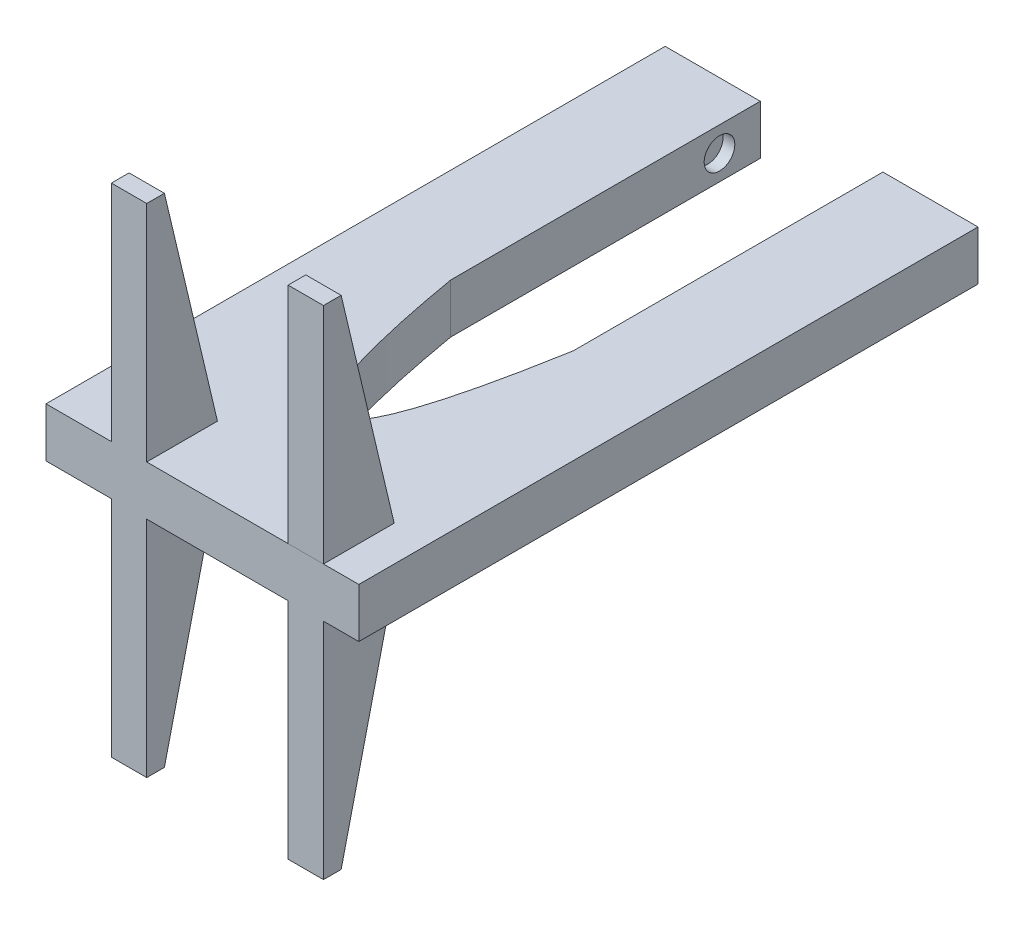
ISO-10303-21;
HEADER;
FILE_DESCRIPTION(('STEP AP214'),'2;1');
FILE_NAME('part.step','',(''),(''),'','','');
FILE_SCHEMA(('AUTOMOTIVE_DESIGN { 1 0 10303 214 1 1 1 1 }'));
ENDSEC;
DATA;
#1=APPLICATION_CONTEXT('core data for automotive mechanical design processes');
#2=APPLICATION_PROTOCOL_DEFINITION('international standard','automotive_design',2000,#1);
#3=PRODUCT_CONTEXT('',#1,'mechanical');
#4=PRODUCT('Part','Part','',(#3));
#5=PRODUCT_RELATED_PRODUCT_CATEGORY('part','',(#4));
#6=PRODUCT_DEFINITION_FORMATION('','',#4);
#7=PRODUCT_DEFINITION_CONTEXT('part definition',#1,'design');
#8=PRODUCT_DEFINITION('design','',#6,#7);
#9=PRODUCT_DEFINITION_SHAPE('','',#8);
#10=(LENGTH_UNIT() NAMED_UNIT(*) SI_UNIT(.MILLI.,.METRE.));
#11=(NAMED_UNIT(*) PLANE_ANGLE_UNIT() SI_UNIT($,.RADIAN.));
#12=(NAMED_UNIT(*) SI_UNIT($,.STERADIAN.) SOLID_ANGLE_UNIT());
#13=UNCERTAINTY_MEASURE_WITH_UNIT(LENGTH_MEASURE(1.E-05),#10,'distance_accuracy_value','');
#14=(GEOMETRIC_REPRESENTATION_CONTEXT(3) GLOBAL_UNCERTAINTY_ASSIGNED_CONTEXT((#13)) GLOBAL_UNIT_ASSIGNED_CONTEXT((#10,
#11,#12)) REPRESENTATION_CONTEXT('',''));
#15=CARTESIAN_POINT('',(0.,0.,0.));
#16=DIRECTION('',(0.,0.,1.));
#17=DIRECTION('',(1.,0.,0.));
#18=AXIS2_PLACEMENT_3D('',#15,#16,#17);
#19=CARTESIAN_POINT('',(-300.,420.,4655.));
#20=DIRECTION('',(0.,-1.,0.));
#21=DIRECTION('',(0.,0.,-1.));
#22=AXIS2_PLACEMENT_3D('',#19,#20,#21);
#23=PLANE('',#22);
#24=DIRECTION('',(0.,0.,-1.));
#25=VECTOR('',#24,1.);
#26=CARTESIAN_POINT('',(0.,420.,4655.));
#27=LINE('',#26,#25);
#28=CARTESIAN_POINT('',(0.,420.,5255.));
#29=VERTEX_POINT('',#28);
#30=CARTESIAN_POINT('',(0.,420.,4655.));
#31=VERTEX_POINT('',#30);
#32=EDGE_CURVE('E109',#29,#31,#27,.T.);
#33=ORIENTED_EDGE('',*,*,#32,.F.);
#34=DIRECTION('',(1.,0.,0.));
#35=VECTOR('',#34,1.);
#36=CARTESIAN_POINT('',(-300.,420.,5255.));
#37=LINE('',#36,#35);
#38=CARTESIAN_POINT('',(-300.,420.,5255.));
#39=VERTEX_POINT('',#38);
#40=EDGE_CURVE('E12',#39,#29,#37,.T.);
#41=ORIENTED_EDGE('',*,*,#40,.F.);
#42=DIRECTION('',(0.,0.,-1.));
#43=VECTOR('',#42,1.);
#44=CARTESIAN_POINT('',(-300.,420.,4655.));
#45=LINE('',#44,#43);
#46=CARTESIAN_POINT('',(-300.,420.,4655.));
#47=VERTEX_POINT('',#46);
#48=EDGE_CURVE('E103',#39,#47,#45,.T.);
#49=ORIENTED_EDGE('',*,*,#48,.T.);
#50=DIRECTION('',(1.,0.,0.));
#51=VECTOR('',#50,1.);
#52=CARTESIAN_POINT('',(-300.,420.,4655.));
#53=LINE('',#52,#51);
#54=EDGE_CURVE('E48',#47,#31,#53,.T.);
#55=ORIENTED_EDGE('',*,*,#54,.T.);
#56=EDGE_LOOP('',(#33,#41,#49,#55));
#57=FACE_BOUND('',#56,.T.);
#58=ADVANCED_FACE('F45',(#57),#23,.T.);
#59=CARTESIAN_POINT('',(-300.,420.,5255.));
#60=DIRECTION('',(0.,0.,1.));
#61=DIRECTION('',(1.,0.,0.));
#62=AXIS2_PLACEMENT_3D('',#59,#60,#61);
#63=PLANE('',#62);
#64=DIRECTION('',(0.,-1.,0.));
#65=VECTOR('',#64,1.);
#66=CARTESIAN_POINT('',(0.,420.,5255.));
#67=LINE('',#66,#65);
#68=CARTESIAN_POINT('',(0.,2320.,5255.));
#69=VERTEX_POINT('',#68);
#70=EDGE_CURVE('E105',#69,#29,#67,.T.);
#71=ORIENTED_EDGE('',*,*,#70,.F.);
#72=DIRECTION('',(1.,0.,0.));
#73=VECTOR('',#72,1.);
#74=CARTESIAN_POINT('',(-300.,2320.,5255.));
#75=LINE('',#74,#73);
#76=CARTESIAN_POINT('',(-300.,2320.,5255.));
#77=VERTEX_POINT('',#76);
#78=EDGE_CURVE('E54',#77,#69,#75,.T.);
#79=ORIENTED_EDGE('',*,*,#78,.F.);
#80=DIRECTION('',(0.,-1.,0.));
#81=VECTOR('',#80,1.);
#82=CARTESIAN_POINT('',(-300.,420.,5255.));
#83=LINE('',#82,#81);
#84=EDGE_CURVE('E100',#77,#39,#83,.T.);
#85=ORIENTED_EDGE('',*,*,#84,.T.);
#86=ORIENTED_EDGE('',*,*,#40,.T.);
#87=EDGE_LOOP('',(#71,#79,#85,#86));
#88=FACE_BOUND('',#87,.T.);
#89=ADVANCED_FACE('F119',(#88),#63,.T.);
#90=CARTESIAN_POINT('',(-300.,2320.,5255.));
#91=DIRECTION('',(0.,1.,0.));
#92=DIRECTION('',(0.,0.,1.));
#93=AXIS2_PLACEMENT_3D('',#90,#91,#92);
#94=PLANE('',#93);
#95=DIRECTION('',(0.,0.,1.));
#96=VECTOR('',#95,1.);
#97=CARTESIAN_POINT('',(0.,2320.,5255.));
#98=LINE('',#97,#96);
#99=CARTESIAN_POINT('',(0.,2320.,5105.));
#100=VERTEX_POINT('',#99);
#101=EDGE_CURVE('E95',#100,#69,#98,.T.);
#102=ORIENTED_EDGE('',*,*,#101,.F.);
#103=DIRECTION('',(1.,0.,0.));
#104=VECTOR('',#103,1.);
#105=CARTESIAN_POINT('',(-300.,2320.,5105.));
#106=LINE('',#105,#104);
#107=CARTESIAN_POINT('',(-300.,2320.,5105.));
#108=VERTEX_POINT('',#107);
#109=EDGE_CURVE('E90',#108,#100,#106,.T.);
#110=ORIENTED_EDGE('',*,*,#109,.F.);
#111=DIRECTION('',(0.,0.,1.));
#112=VECTOR('',#111,1.);
#113=CARTESIAN_POINT('',(-300.,2320.,5255.));
#114=LINE('',#113,#112);
#115=EDGE_CURVE('E93',#108,#77,#114,.T.);
#116=ORIENTED_EDGE('',*,*,#115,.T.);
#117=ORIENTED_EDGE('',*,*,#78,.T.);
#118=EDGE_LOOP('',(#102,#110,#116,#117));
#119=FACE_BOUND('',#118,.T.);
#120=ADVANCED_FACE('F92',(#119),#94,.T.);
#121=CARTESIAN_POINT('',(-300.,2320.,5105.));
#122=DIRECTION('',(0.,0.230466383879212,-0.97308028749001));
#123=DIRECTION('',(0.,0.97308028749001,0.230466383879212));
#124=AXIS2_PLACEMENT_3D('',#121,#122,#123);
#125=PLANE('',#124);
#126=DIRECTION('',(0.,0.97308028749001,0.230466383879212));
#127=VECTOR('',#126,1.);
#128=CARTESIAN_POINT('',(0.,2320.,5105.));
#129=LINE('',#128,#127);
#130=EDGE_CURVE('E112',#31,#100,#129,.T.);
#131=ORIENTED_EDGE('',*,*,#130,.F.);
#132=ORIENTED_EDGE('',*,*,#54,.F.);
#133=DIRECTION('',(0.,0.97308028749001,0.230466383879212));
#134=VECTOR('',#133,1.);
#135=CARTESIAN_POINT('',(-300.,2320.,5105.));
#136=LINE('',#135,#134);
#137=EDGE_CURVE('E99',#47,#108,#136,.T.);
#138=ORIENTED_EDGE('',*,*,#137,.T.);
#139=ORIENTED_EDGE('',*,*,#109,.T.);
#140=EDGE_LOOP('',(#131,#132,#138,#139));
#141=FACE_BOUND('',#140,.T.);
#142=ADVANCED_FACE('F102',(#141),#125,.T.);
#143=CARTESIAN_POINT('',(-300.,0.,0.));
#144=DIRECTION('',(-1.,0.,0.));
#145=DIRECTION('',(0.,0.,1.));
#146=AXIS2_PLACEMENT_3D('',#143,#144,#145);
#147=PLANE('',#146);
#148=ORIENTED_EDGE('',*,*,#48,.F.);
#149=ORIENTED_EDGE('',*,*,#84,.F.);
#150=ORIENTED_EDGE('',*,*,#115,.F.);
#151=ORIENTED_EDGE('',*,*,#137,.F.);
#152=EDGE_LOOP('',(#148,#149,#150,#151));
#153=FACE_BOUND('',#152,.T.);
#154=ADVANCED_FACE('F98',(#153),#147,.T.);
#155=CARTESIAN_POINT('',(0.,0.,0.));
#156=DIRECTION('',(-1.,0.,0.));
#157=DIRECTION('',(0.,0.,1.));
#158=AXIS2_PLACEMENT_3D('',#155,#156,#157);
#159=PLANE('',#158);
#160=ORIENTED_EDGE('',*,*,#32,.T.);
#161=ORIENTED_EDGE('',*,*,#130,.T.);
#162=ORIENTED_EDGE('',*,*,#101,.T.);
#163=ORIENTED_EDGE('',*,*,#70,.T.);
#164=EDGE_LOOP('',(#160,#161,#162,#163));
#165=FACE_BOUND('',#164,.T.);
#166=ADVANCED_FACE('F118',(#165),#159,.F.);
#167=CLOSED_SHELL('',(#58,#89,#120,#142,#154,#166));
#168=MANIFOLD_SOLID_BREP('B2',#167);
#169=CARTESIAN_POINT('',(-1027.5,0.,4120.1934343167));
#170=DIRECTION('',(0.,-1.,0.));
#171=DIRECTION('',(0.,0.,-1.));
#172=AXIS2_PLACEMENT_3D('',#169,#170,#171);
#173=PLANE('',#172);
#174=DIRECTION('',(1.,0.,0.));
#175=VECTOR('',#174,1.);
#176=CARTESIAN_POINT('',(300.000000000001,0.,5255.));
#177=LINE('',#176,#175);
#178=CARTESIAN_POINT('',(-1500.,0.,5255.));
#179=VERTEX_POINT('',#178);
#180=CARTESIAN_POINT('',(-300.,0.,5255.));
#181=VERTEX_POINT('',#180);
#182=EDGE_CURVE('E506',#179,#181,#177,.T.);
#183=ORIENTED_EDGE('',*,*,#182,.F.);
#184=DIRECTION('',(0.,0.,-1.));
#185=VECTOR('',#184,1.);
#186=CARTESIAN_POINT('',(-1500.,0.,4655.));
#187=LINE('',#186,#185);
#188=CARTESIAN_POINT('',(-1500.,0.,4655.));
#189=VERTEX_POINT('',#188);
#190=EDGE_CURVE('E322',#179,#189,#187,.T.);
#191=ORIENTED_EDGE('',*,*,#190,.T.);
#192=DIRECTION('',(-1.,0.,0.));
#193=VECTOR('',#192,1.);
#194=CARTESIAN_POINT('',(-1500.,0.,4655.));
#195=LINE('',#194,#193);
#196=CARTESIAN_POINT('',(-1800.,0.,4655.));
#197=VERTEX_POINT('',#196);
#198=EDGE_CURVE('E328',#189,#197,#195,.T.);
#199=ORIENTED_EDGE('',*,*,#198,.T.);
#200=DIRECTION('',(0.,0.,-1.));
#201=VECTOR('',#200,1.);
#202=CARTESIAN_POINT('',(-1800.,0.,4655.));
#203=LINE('',#202,#201);
#204=CARTESIAN_POINT('',(-1800.,0.,5255.));
#205=VERTEX_POINT('',#204);
#206=EDGE_CURVE('E332',#205,#197,#203,.T.);
#207=ORIENTED_EDGE('',*,*,#206,.F.);
#208=CARTESIAN_POINT('',(-2355.,0.,5255.));
#209=VERTEX_POINT('',#208);
#210=EDGE_CURVE('E504',#209,#205,#177,.T.);
#211=ORIENTED_EDGE('',*,*,#210,.F.);
#212=DIRECTION('',(0.,0.,1.));
#213=VECTOR('',#212,1.);
#214=CARTESIAN_POINT('',(-2355.,0.,5255.));
#215=LINE('',#214,#213);
#216=CARTESIAN_POINT('',(-2355.,0.,0.));
#217=VERTEX_POINT('',#216);
#218=EDGE_CURVE('E468',#217,#209,#215,.T.);
#219=ORIENTED_EDGE('',*,*,#218,.F.);
#220=DIRECTION('',(-1.,0.,0.));
#221=VECTOR('',#220,1.);
#222=CARTESIAN_POINT('',(-2355.,0.,0.));
#223=LINE('',#222,#221);
#224=CARTESIAN_POINT('',(-1548.,0.,0.));
#225=VERTEX_POINT('',#224);
#226=EDGE_CURVE('E460',#225,#217,#223,.T.);
#227=ORIENTED_EDGE('',*,*,#226,.F.);
#228=DIRECTION('',(0.,0.,-1.));
#229=VECTOR('',#228,1.);
#230=CARTESIAN_POINT('',(-1548.,0.,0.));
#231=LINE('',#230,#229);
#232=CARTESIAN_POINT('',(-1548.,0.,2627.5));
#233=VERTEX_POINT('',#232);
#234=EDGE_CURVE('E469',#233,#225,#231,.T.);
#235=ORIENTED_EDGE('',*,*,#234,.F.);
#236=CARTESIAN_POINT('',(-506.999999999999,0.,2627.5));
#237=CARTESIAN_POINT('',(-1027.5,0.,5612.8868686334));
#238=CARTESIAN_POINT('',(-1548.,0.,2627.5));
#239=B_SPLINE_CURVE_WITH_KNOTS('',2,(#236,#237,#238),.UNSPECIFIED.,.F.,.F.,(3,3),(0.,1.),.UNSPECIFIED.);
#240=CARTESIAN_POINT('',(-506.999999999999,0.,2627.5));
#241=VERTEX_POINT('',#240);
#242=EDGE_CURVE('E489',#241,#233,#239,.T.);
#243=ORIENTED_EDGE('',*,*,#242,.F.);
#244=DIRECTION('',(0.,0.,1.));
#245=VECTOR('',#244,1.);
#246=CARTESIAN_POINT('',(-507.,0.,0.));
#247=LINE('',#246,#245);
#248=CARTESIAN_POINT('',(-507.,0.,0.));
#249=VERTEX_POINT('',#248);
#250=EDGE_CURVE('E491',#249,#241,#247,.T.);
#251=ORIENTED_EDGE('',*,*,#250,.F.);
#252=DIRECTION('',(-1.,0.,0.));
#253=VECTOR('',#252,1.);
#254=CARTESIAN_POINT('',(300.,0.,0.));
#255=LINE('',#254,#253);
#256=CARTESIAN_POINT('',(300.,0.,0.));
#257=VERTEX_POINT('',#256);
#258=EDGE_CURVE('E399',#257,#249,#255,.T.);
#259=ORIENTED_EDGE('',*,*,#258,.F.);
#260=DIRECTION('',(0.,0.,-1.));
#261=VECTOR('',#260,1.);
#262=CARTESIAN_POINT('',(300.,0.,0.));
#263=LINE('',#262,#261);
#264=CARTESIAN_POINT('',(300.000000000001,0.,5255.));
#265=VERTEX_POINT('',#264);
#266=EDGE_CURVE('E404',#265,#257,#263,.T.);
#267=ORIENTED_EDGE('',*,*,#266,.F.);
#268=CARTESIAN_POINT('',(0.,0.,5255.));
#269=VERTEX_POINT('',#268);
#270=EDGE_CURVE('E503',#269,#265,#177,.T.);
#271=ORIENTED_EDGE('',*,*,#270,.F.);
#272=DIRECTION('',(0.,0.,-1.));
#273=VECTOR('',#272,1.);
#274=CARTESIAN_POINT('',(0.,0.,4655.));
#275=LINE('',#274,#273);
#276=CARTESIAN_POINT('',(0.,0.,4655.));
#277=VERTEX_POINT('',#276);
#278=EDGE_CURVE('E193',#269,#277,#275,.T.);
#279=ORIENTED_EDGE('',*,*,#278,.T.);
#280=DIRECTION('',(1.,0.,0.));
#281=VECTOR('',#280,1.);
#282=CARTESIAN_POINT('',(-300.,0.,4655.));
#283=LINE('',#282,#281);
#284=CARTESIAN_POINT('',(-300.,0.,4655.));
#285=VERTEX_POINT('',#284);
#286=EDGE_CURVE('E348',#285,#277,#283,.T.);
#287=ORIENTED_EDGE('',*,*,#286,.F.);
#288=DIRECTION('',(0.,0.,-1.));
#289=VECTOR('',#288,1.);
#290=CARTESIAN_POINT('',(-300.,0.,4655.));
#291=LINE('',#290,#289);
#292=EDGE_CURVE('E345',#181,#285,#291,.T.);
#293=ORIENTED_EDGE('',*,*,#292,.F.);
#294=EDGE_LOOP('',(#183,#191,#199,#207,#211,#219,#227,#235,#243,#251,#259,#267,#271,#279,#287,#293));
#295=FACE_BOUND('',#294,.T.);
#296=ADVANCED_FACE('F169',(#295),#173,.T.);
#297=CARTESIAN_POINT('',(300.,420.,0.));
#298=DIRECTION('',(0.,0.,1.));
#299=DIRECTION('',(1.,0.,0.));
#300=AXIS2_PLACEMENT_3D('',#297,#298,#299);
#301=PLANE('',#300);
#302=ORIENTED_EDGE('',*,*,#258,.T.);
#303=DIRECTION('',(0.,-1.,0.));
#304=VECTOR('',#303,1.);
#305=CARTESIAN_POINT('',(-507.,420.,0.));
#306=LINE('',#305,#304);
#307=CARTESIAN_POINT('',(-507.,420.,0.));
#308=VERTEX_POINT('',#307);
#309=EDGE_CURVE('E43',#308,#249,#306,.T.);
#310=ORIENTED_EDGE('',*,*,#309,.F.);
#311=DIRECTION('',(-1.,0.,0.));
#312=VECTOR('',#311,1.);
#313=CARTESIAN_POINT('',(300.,420.,0.));
#314=LINE('',#313,#312);
#315=CARTESIAN_POINT('',(300.,420.,0.));
#316=VERTEX_POINT('',#315);
#317=EDGE_CURVE('E400',#316,#308,#314,.T.);
#318=ORIENTED_EDGE('',*,*,#317,.F.);
#319=DIRECTION('',(0.,-1.,0.));
#320=VECTOR('',#319,1.);
#321=CARTESIAN_POINT('',(300.,420.,0.));
#322=LINE('',#321,#320);
#323=EDGE_CURVE('E508',#316,#257,#322,.T.);
#324=ORIENTED_EDGE('',*,*,#323,.T.);
#325=EDGE_LOOP('',(#302,#310,#318,#324));
#326=FACE_BOUND('',#325,.T.);
#327=ADVANCED_FACE('F171',(#326),#301,.F.);
#328=CARTESIAN_POINT('',(-507.,420.,0.));
#329=DIRECTION('',(1.,0.,0.));
#330=DIRECTION('',(0.,0.,-1.));
#331=AXIS2_PLACEMENT_3D('',#328,#329,#330);
#332=PLANE('',#331);
#333=CARTESIAN_POINT('',(-507.,210.,346.012024202326));
#334=DIRECTION('',(1.,0.,0.));
#335=DIRECTION('',(0.,0.,-1.));
#336=AXIS2_PLACEMENT_3D('',#333,#334,#335);
#337=CIRCLE('',#336,130.);
#338=CARTESIAN_POINT('',(-507.,210.,216.012024202326));
#339=VERTEX_POINT('',#338);
#340=EDGE_CURVE('E334',#339,#339,#337,.T.);
#341=ORIENTED_EDGE('',*,*,#340,.T.);
#342=EDGE_LOOP('',(#341));
#343=FACE_BOUND('',#342,.T.);
#344=ORIENTED_EDGE('',*,*,#250,.T.);
#345=DIRECTION('',(0.,-1.,0.));
#346=VECTOR('',#345,1.);
#347=CARTESIAN_POINT('',(-506.999999999999,420.,2627.5));
#348=LINE('',#347,#346);
#349=CARTESIAN_POINT('',(-506.999999999999,420.,2627.5));
#350=VERTEX_POINT('',#349);
#351=EDGE_CURVE('E178',#350,#241,#348,.T.);
#352=ORIENTED_EDGE('',*,*,#351,.F.);
#353=DIRECTION('',(0.,0.,1.));
#354=VECTOR('',#353,1.);
#355=CARTESIAN_POINT('',(-507.,420.,0.));
#356=LINE('',#355,#354);
#357=EDGE_CURVE('E403',#308,#350,#356,.T.);
#358=ORIENTED_EDGE('',*,*,#357,.F.);
#359=ORIENTED_EDGE('',*,*,#309,.T.);
#360=EDGE_LOOP('',(#344,#352,#358,#359));
#361=FACE_BOUND('',#360,.T.);
#362=ADVANCED_FACE('F421',(#343,#361),#332,.F.);
#363=CARTESIAN_POINT('',(-506.999999999999,420.,2627.5));
#364=CARTESIAN_POINT('',(-1027.5,420.,5612.8868686334));
#365=CARTESIAN_POINT('',(-1548.,420.,2627.5));
#366=B_SPLINE_CURVE_WITH_KNOTS('',2,(#363,#364,#365),.UNSPECIFIED.,.F.,.F.,(3,3),(0.,1.),.UNSPECIFIED.);
#367=DIRECTION('',(0.,-1.,0.));
#368=VECTOR('',#367,1.);
#369=SURFACE_OF_LINEAR_EXTRUSION('',#366,#368);
#370=ORIENTED_EDGE('',*,*,#242,.T.);
#371=DIRECTION('',(0.,-1.,0.));
#372=VECTOR('',#371,1.);
#373=CARTESIAN_POINT('',(-1548.,420.,2627.5));
#374=LINE('',#373,#372);
#375=CARTESIAN_POINT('',(-1548.,420.,2627.5));
#376=VERTEX_POINT('',#375);
#377=EDGE_CURVE('E476',#376,#233,#374,.T.);
#378=ORIENTED_EDGE('',*,*,#377,.F.);
#379=EDGE_CURVE('E406',#350,#376,#366,.T.);
#380=ORIENTED_EDGE('',*,*,#379,.F.);
#381=ORIENTED_EDGE('',*,*,#351,.T.);
#382=EDGE_LOOP('',(#370,#378,#380,#381));
#383=FACE_BOUND('',#382,.T.);
#384=ADVANCED_FACE('F417',(#383),#369,.F.);
#385=CARTESIAN_POINT('',(-1548.,420.,0.));
#386=DIRECTION('',(-1.,0.,0.));
#387=DIRECTION('',(0.,0.,1.));
#388=AXIS2_PLACEMENT_3D('',#385,#386,#387);
#389=PLANE('',#388);
#390=CARTESIAN_POINT('',(-1548.,210.,346.012024202326));
#391=DIRECTION('',(-1.,0.,0.));
#392=DIRECTION('',(0.,0.,1.));
#393=AXIS2_PLACEMENT_3D('',#390,#391,#392);
#394=CIRCLE('',#393,130.);
#395=CARTESIAN_POINT('',(-1548.,210.,476.012024202326));
#396=VERTEX_POINT('',#395);
#397=EDGE_CURVE('E173',#396,#396,#394,.T.);
#398=ORIENTED_EDGE('',*,*,#397,.T.);
#399=EDGE_LOOP('',(#398));
#400=FACE_BOUND('',#399,.T.);
#401=ORIENTED_EDGE('',*,*,#234,.T.);
#402=DIRECTION('',(0.,-1.,0.));
#403=VECTOR('',#402,1.);
#404=CARTESIAN_POINT('',(-1548.,420.,0.));
#405=LINE('',#404,#403);
#406=CARTESIAN_POINT('',(-1548.,420.,0.));
#407=VERTEX_POINT('',#406);
#408=EDGE_CURVE('E466',#407,#225,#405,.T.);
#409=ORIENTED_EDGE('',*,*,#408,.F.);
#410=DIRECTION('',(0.,0.,-1.));
#411=VECTOR('',#410,1.);
#412=CARTESIAN_POINT('',(-1548.,420.,0.));
#413=LINE('',#412,#411);
#414=EDGE_CURVE('E411',#376,#407,#413,.T.);
#415=ORIENTED_EDGE('',*,*,#414,.F.);
#416=ORIENTED_EDGE('',*,*,#377,.T.);
#417=EDGE_LOOP('',(#401,#409,#415,#416));
#418=FACE_BOUND('',#417,.T.);
#419=ADVANCED_FACE('F420',(#400,#418),#389,.F.);
#420=CARTESIAN_POINT('',(-2355.,420.,0.));
#421=DIRECTION('',(0.,0.,1.));
#422=DIRECTION('',(1.,0.,0.));
#423=AXIS2_PLACEMENT_3D('',#420,#421,#422);
#424=PLANE('',#423);
#425=ORIENTED_EDGE('',*,*,#226,.T.);
#426=DIRECTION('',(0.,-1.,0.));
#427=VECTOR('',#426,1.);
#428=CARTESIAN_POINT('',(-2355.,420.,0.));
#429=LINE('',#428,#427);
#430=CARTESIAN_POINT('',(-2355.,420.,0.));
#431=VERTEX_POINT('',#430);
#432=EDGE_CURVE('E463',#431,#217,#429,.T.);
#433=ORIENTED_EDGE('',*,*,#432,.F.);
#434=DIRECTION('',(-1.,0.,0.));
#435=VECTOR('',#434,1.);
#436=CARTESIAN_POINT('',(-2355.,420.,0.));
#437=LINE('',#436,#435);
#438=EDGE_CURVE('E524',#407,#431,#437,.T.);
#439=ORIENTED_EDGE('',*,*,#438,.F.);
#440=ORIENTED_EDGE('',*,*,#408,.T.);
#441=EDGE_LOOP('',(#425,#433,#439,#440));
#442=FACE_BOUND('',#441,.T.);
#443=ADVANCED_FACE('F448',(#442),#424,.F.);
#444=CARTESIAN_POINT('',(-2355.,420.,5255.));
#445=DIRECTION('',(1.,0.,0.));
#446=DIRECTION('',(0.,0.,-1.));
#447=AXIS2_PLACEMENT_3D('',#444,#445,#446);
#448=PLANE('',#447);
#449=ORIENTED_EDGE('',*,*,#218,.T.);
#450=DIRECTION('',(0.,-1.,0.));
#451=VECTOR('',#450,1.);
#452=CARTESIAN_POINT('',(-2355.,420.,5255.));
#453=LINE('',#452,#451);
#454=CARTESIAN_POINT('',(-2355.,420.,5255.));
#455=VERTEX_POINT('',#454);
#456=EDGE_CURVE('E474',#455,#209,#453,.T.);
#457=ORIENTED_EDGE('',*,*,#456,.F.);
#458=DIRECTION('',(0.,0.,1.));
#459=VECTOR('',#458,1.);
#460=CARTESIAN_POINT('',(-2355.,420.,0.));
#461=LINE('',#460,#459);
#462=EDGE_CURVE('E473',#431,#455,#461,.T.);
#463=ORIENTED_EDGE('',*,*,#462,.F.);
#464=ORIENTED_EDGE('',*,*,#432,.T.);
#465=EDGE_LOOP('',(#449,#457,#463,#464));
#466=FACE_BOUND('',#465,.T.);
#467=ADVANCED_FACE('F446',(#466),#448,.F.);
#468=CARTESIAN_POINT('',(300.000000000001,420.,5255.));
#469=DIRECTION('',(0.,0.,-1.));
#470=DIRECTION('',(-1.,0.,0.));
#471=AXIS2_PLACEMENT_3D('',#468,#469,#470);
#472=PLANE('',#471);
#473=ORIENTED_EDGE('',*,*,#210,.T.);
#474=DIRECTION('',(0.,1.,0.));
#475=VECTOR('',#474,1.);
#476=CARTESIAN_POINT('',(-1800.,0.,5255.));
#477=LINE('',#476,#475);
#478=CARTESIAN_POINT('',(-1800.,-1900.,5255.));
#479=VERTEX_POINT('',#478);
#480=EDGE_CURVE('E308',#479,#205,#477,.T.);
#481=ORIENTED_EDGE('',*,*,#480,.F.);
#482=DIRECTION('',(-1.,0.,0.));
#483=VECTOR('',#482,1.);
#484=CARTESIAN_POINT('',(-1500.,-1900.,5255.));
#485=LINE('',#484,#483);
#486=CARTESIAN_POINT('',(-1500.,-1900.,5255.));
#487=VERTEX_POINT('',#486);
#488=EDGE_CURVE('E305',#487,#479,#485,.T.);
#489=ORIENTED_EDGE('',*,*,#488,.F.);
#490=DIRECTION('',(0.,1.,0.));
#491=VECTOR('',#490,1.);
#492=CARTESIAN_POINT('',(-1500.,0.,5255.));
#493=LINE('',#492,#491);
#494=EDGE_CURVE('E185',#487,#179,#493,.T.);
#495=ORIENTED_EDGE('',*,*,#494,.T.);
#496=ORIENTED_EDGE('',*,*,#182,.T.);
#497=DIRECTION('',(0.,1.,0.));
#498=VECTOR('',#497,1.);
#499=CARTESIAN_POINT('',(-300.,0.,5255.));
#500=LINE('',#499,#498);
#501=CARTESIAN_POINT('',(-300.,-1900.,5255.));
#502=VERTEX_POINT('',#501);
#503=EDGE_CURVE('E357',#502,#181,#500,.T.);
#504=ORIENTED_EDGE('',*,*,#503,.F.);
#505=DIRECTION('',(1.,0.,0.));
#506=VECTOR('',#505,1.);
#507=CARTESIAN_POINT('',(-300.,-1900.,5255.));
#508=LINE('',#507,#506);
#509=CARTESIAN_POINT('',(0.,-1900.,5255.));
#510=VERTEX_POINT('',#509);
#511=EDGE_CURVE('E354',#502,#510,#508,.T.);
#512=ORIENTED_EDGE('',*,*,#511,.T.);
#513=DIRECTION('',(0.,1.,0.));
#514=VECTOR('',#513,1.);
#515=CARTESIAN_POINT('',(0.,0.,5255.));
#516=LINE('',#515,#514);
#517=EDGE_CURVE('E351',#510,#269,#516,.T.);
#518=ORIENTED_EDGE('',*,*,#517,.T.);
#519=ORIENTED_EDGE('',*,*,#270,.T.);
#520=DIRECTION('',(0.,-1.,0.));
#521=VECTOR('',#520,1.);
#522=CARTESIAN_POINT('',(300.000000000001,420.,5255.));
#523=LINE('',#522,#521);
#524=CARTESIAN_POINT('',(300.000000000001,420.,5255.));
#525=VERTEX_POINT('',#524);
#526=EDGE_CURVE('E478',#525,#265,#523,.T.);
#527=ORIENTED_EDGE('',*,*,#526,.F.);
#528=DIRECTION('',(1.,0.,0.));
#529=VECTOR('',#528,1.);
#530=CARTESIAN_POINT('',(300.000000000001,420.,5255.));
#531=LINE('',#530,#529);
#532=CARTESIAN_POINT('',(-1500.,420.,5255.));
#533=VERTEX_POINT('',#532);
#534=EDGE_CURVE('E523',#533,#525,#531,.T.);
#535=ORIENTED_EDGE('',*,*,#534,.F.);
#536=DIRECTION('',(0.,-1.,0.));
#537=VECTOR('',#536,1.);
#538=CARTESIAN_POINT('',(-1500.,420.,5255.));
#539=LINE('',#538,#537);
#540=CARTESIAN_POINT('',(-1500.,2320.,5255.));
#541=VERTEX_POINT('',#540);
#542=EDGE_CURVE('E380',#541,#533,#539,.T.);
#543=ORIENTED_EDGE('',*,*,#542,.F.);
#544=DIRECTION('',(-1.,0.,0.));
#545=VECTOR('',#544,1.);
#546=CARTESIAN_POINT('',(-1500.,2320.,5255.));
#547=LINE('',#546,#545);
#548=CARTESIAN_POINT('',(-1800.,2320.,5255.));
#549=VERTEX_POINT('',#548);
#550=EDGE_CURVE('E383',#541,#549,#547,.T.);
#551=ORIENTED_EDGE('',*,*,#550,.T.);
#552=DIRECTION('',(0.,-1.,0.));
#553=VECTOR('',#552,1.);
#554=CARTESIAN_POINT('',(-1800.,420.,5255.));
#555=LINE('',#554,#553);
#556=CARTESIAN_POINT('',(-1800.,420.,5255.));
#557=VERTEX_POINT('',#556);
#558=EDGE_CURVE('E376',#549,#557,#555,.T.);
#559=ORIENTED_EDGE('',*,*,#558,.T.);
#560=EDGE_CURVE('E521',#455,#557,#531,.T.);
#561=ORIENTED_EDGE('',*,*,#560,.F.);
#562=ORIENTED_EDGE('',*,*,#456,.T.);
#563=EDGE_LOOP('',(#473,#481,#489,#495,#496,#504,#512,#518,#519,#527,#535,#543,#551,#559,#561,#562));
#564=FACE_BOUND('',#563,.T.);
#565=ADVANCED_FACE('F307',(#564),#472,.F.);
#566=CARTESIAN_POINT('',(300.,420.,0.));
#567=DIRECTION('',(-1.,0.,0.));
#568=DIRECTION('',(0.,0.,1.));
#569=AXIS2_PLACEMENT_3D('',#566,#567,#568);
#570=PLANE('',#569);
#571=ORIENTED_EDGE('',*,*,#266,.T.);
#572=ORIENTED_EDGE('',*,*,#323,.F.);
#573=DIRECTION('',(0.,0.,-1.));
#574=VECTOR('',#573,1.);
#575=CARTESIAN_POINT('',(300.,420.,0.));
#576=LINE('',#575,#574);
#577=EDGE_CURVE('E510',#525,#316,#576,.T.);
#578=ORIENTED_EDGE('',*,*,#577,.F.);
#579=ORIENTED_EDGE('',*,*,#526,.T.);
#580=EDGE_LOOP('',(#571,#572,#578,#579));
#581=FACE_BOUND('',#580,.T.);
#582=ADVANCED_FACE('F440',(#581),#570,.F.);
#583=CARTESIAN_POINT('',(-1027.5,420.,4120.1934343167));
#584=DIRECTION('',(0.,-1.,0.));
#585=DIRECTION('',(0.,0.,-1.));
#586=AXIS2_PLACEMENT_3D('',#583,#584,#585);
#587=PLANE('',#586);
#588=ORIENTED_EDGE('',*,*,#560,.T.);
#589=DIRECTION('',(0.,0.,-1.));
#590=VECTOR('',#589,1.);
#591=CARTESIAN_POINT('',(-1800.,420.,4655.));
#592=LINE('',#591,#590);
#593=CARTESIAN_POINT('',(-1800.,420.,4655.));
#594=VERTEX_POINT('',#593);
#595=EDGE_CURVE('E371',#557,#594,#592,.T.);
#596=ORIENTED_EDGE('',*,*,#595,.T.);
#597=DIRECTION('',(-1.,0.,0.));
#598=VECTOR('',#597,1.);
#599=CARTESIAN_POINT('',(-1500.,420.,4655.));
#600=LINE('',#599,#598);
#601=CARTESIAN_POINT('',(-1500.,420.,4655.));
#602=VERTEX_POINT('',#601);
#603=EDGE_CURVE('E396',#602,#594,#600,.T.);
#604=ORIENTED_EDGE('',*,*,#603,.F.);
#605=DIRECTION('',(0.,0.,-1.));
#606=VECTOR('',#605,1.);
#607=CARTESIAN_POINT('',(-1500.,420.,4655.));
#608=LINE('',#607,#606);
#609=EDGE_CURVE('E372',#533,#602,#608,.T.);
#610=ORIENTED_EDGE('',*,*,#609,.F.);
#611=ORIENTED_EDGE('',*,*,#534,.T.);
#612=ORIENTED_EDGE('',*,*,#577,.T.);
#613=ORIENTED_EDGE('',*,*,#317,.T.);
#614=ORIENTED_EDGE('',*,*,#357,.T.);
#615=ORIENTED_EDGE('',*,*,#379,.T.);
#616=ORIENTED_EDGE('',*,*,#414,.T.);
#617=ORIENTED_EDGE('',*,*,#438,.T.);
#618=ORIENTED_EDGE('',*,*,#462,.T.);
#619=EDGE_LOOP('',(#588,#596,#604,#610,#611,#612,#613,#614,#615,#616,#617,#618));
#620=FACE_BOUND('',#619,.T.);
#621=ADVANCED_FACE('F438',(#620),#587,.F.);
#622=CARTESIAN_POINT('',(-1500.,2320.,5105.));
#623=DIRECTION('',(0.,-0.230466383879212,0.97308028749001));
#624=DIRECTION('',(0.,-0.97308028749001,-0.230466383879212));
#625=AXIS2_PLACEMENT_3D('',#622,#623,#624);
#626=PLANE('',#625);
#627=DIRECTION('',(0.,0.97308028749001,0.230466383879212));
#628=VECTOR('',#627,1.);
#629=CARTESIAN_POINT('',(-1800.,2320.,5105.));
#630=LINE('',#629,#628);
#631=CARTESIAN_POINT('',(-1800.,2320.,5105.));
#632=VERTEX_POINT('',#631);
#633=EDGE_CURVE('E385',#594,#632,#630,.T.);
#634=ORIENTED_EDGE('',*,*,#633,.T.);
#635=DIRECTION('',(-1.,0.,0.));
#636=VECTOR('',#635,1.);
#637=CARTESIAN_POINT('',(-1500.,2320.,5105.));
#638=LINE('',#637,#636);
#639=CARTESIAN_POINT('',(-1500.,2320.,5105.));
#640=VERTEX_POINT('',#639);
#641=EDGE_CURVE('E393',#640,#632,#638,.T.);
#642=ORIENTED_EDGE('',*,*,#641,.F.);
#643=DIRECTION('',(0.,0.97308028749001,0.230466383879212));
#644=VECTOR('',#643,1.);
#645=CARTESIAN_POINT('',(-1500.,2320.,5105.));
#646=LINE('',#645,#644);
#647=EDGE_CURVE('E375',#602,#640,#646,.T.);
#648=ORIENTED_EDGE('',*,*,#647,.F.);
#649=ORIENTED_EDGE('',*,*,#603,.T.);
#650=EDGE_LOOP('',(#634,#642,#648,#649));
#651=FACE_BOUND('',#650,.T.);
#652=ADVANCED_FACE('F609',(#651),#626,.F.);
#653=CARTESIAN_POINT('',(-1500.,2320.,5255.));
#654=DIRECTION('',(0.,-1.,0.));
#655=DIRECTION('',(0.,0.,-1.));
#656=AXIS2_PLACEMENT_3D('',#653,#654,#655);
#657=PLANE('',#656);
#658=DIRECTION('',(0.,0.,1.));
#659=VECTOR('',#658,1.);
#660=CARTESIAN_POINT('',(-1800.,2320.,5255.));
#661=LINE('',#660,#659);
#662=EDGE_CURVE('E387',#632,#549,#661,.T.);
#663=ORIENTED_EDGE('',*,*,#662,.T.);
#664=ORIENTED_EDGE('',*,*,#550,.F.);
#665=DIRECTION('',(0.,0.,1.));
#666=VECTOR('',#665,1.);
#667=CARTESIAN_POINT('',(-1500.,2320.,5255.));
#668=LINE('',#667,#666);
#669=EDGE_CURVE('E378',#640,#541,#668,.T.);
#670=ORIENTED_EDGE('',*,*,#669,.F.);
#671=ORIENTED_EDGE('',*,*,#641,.T.);
#672=EDGE_LOOP('',(#663,#664,#670,#671));
#673=FACE_BOUND('',#672,.T.);
#674=ADVANCED_FACE('F537',(#673),#657,.F.);
#675=CARTESIAN_POINT('',(-1500.,0.,0.));
#676=DIRECTION('',(-1.,0.,0.));
#677=DIRECTION('',(0.,0.,1.));
#678=AXIS2_PLACEMENT_3D('',#675,#676,#677);
#679=PLANE('',#678);
#680=ORIENTED_EDGE('',*,*,#609,.T.);
#681=ORIENTED_EDGE('',*,*,#647,.T.);
#682=ORIENTED_EDGE('',*,*,#669,.T.);
#683=ORIENTED_EDGE('',*,*,#542,.T.);
#684=EDGE_LOOP('',(#680,#681,#682,#683));
#685=FACE_BOUND('',#684,.T.);
#686=ADVANCED_FACE('F531',(#685),#679,.F.);
#687=CARTESIAN_POINT('',(-1800.,0.,0.));
#688=DIRECTION('',(-1.,0.,0.));
#689=DIRECTION('',(0.,0.,1.));
#690=AXIS2_PLACEMENT_3D('',#687,#688,#689);
#691=PLANE('',#690);
#692=ORIENTED_EDGE('',*,*,#595,.F.);
#693=ORIENTED_EDGE('',*,*,#558,.F.);
#694=ORIENTED_EDGE('',*,*,#662,.F.);
#695=ORIENTED_EDGE('',*,*,#633,.F.);
#696=EDGE_LOOP('',(#692,#693,#694,#695));
#697=FACE_BOUND('',#696,.T.);
#698=ADVANCED_FACE('F543',(#697),#691,.T.);
#699=CARTESIAN_POINT('',(-300.,-1900.,5255.));
#700=DIRECTION('',(0.,-1.,0.));
#701=DIRECTION('',(0.,0.,1.));
#702=AXIS2_PLACEMENT_3D('',#699,#700,#701);
#703=PLANE('',#702);
#704=DIRECTION('',(0.,0.,1.));
#705=VECTOR('',#704,1.);
#706=CARTESIAN_POINT('',(0.,-1900.,5255.));
#707=LINE('',#706,#705);
#708=CARTESIAN_POINT('',(0.,-1900.,5105.));
#709=VERTEX_POINT('',#708);
#710=EDGE_CURVE('E360',#709,#510,#707,.T.);
#711=ORIENTED_EDGE('',*,*,#710,.T.);
#712=ORIENTED_EDGE('',*,*,#511,.F.);
#713=DIRECTION('',(0.,0.,1.));
#714=VECTOR('',#713,1.);
#715=CARTESIAN_POINT('',(-300.,-1900.,5255.));
#716=LINE('',#715,#714);
#717=CARTESIAN_POINT('',(-300.,-1900.,5105.));
#718=VERTEX_POINT('',#717);
#719=EDGE_CURVE('E365',#718,#502,#716,.T.);
#720=ORIENTED_EDGE('',*,*,#719,.F.);
#721=DIRECTION('',(1.,0.,0.));
#722=VECTOR('',#721,1.);
#723=CARTESIAN_POINT('',(-300.,-1900.,5105.));
#724=LINE('',#723,#722);
#725=EDGE_CURVE('E362',#718,#709,#724,.T.);
#726=ORIENTED_EDGE('',*,*,#725,.T.);
#727=EDGE_LOOP('',(#711,#712,#720,#726));
#728=FACE_BOUND('',#727,.T.);
#729=ADVANCED_FACE('F589',(#728),#703,.T.);
#730=CARTESIAN_POINT('',(-300.,-1900.,5105.));
#731=DIRECTION('',(0.,-0.230466383879212,-0.97308028749001));
#732=DIRECTION('',(0.,-0.97308028749001,0.230466383879212));
#733=AXIS2_PLACEMENT_3D('',#730,#731,#732);
#734=PLANE('',#733);
#735=DIRECTION('',(0.,-0.97308028749001,0.230466383879212));
#736=VECTOR('',#735,1.);
#737=CARTESIAN_POINT('',(0.,-1900.,5105.));
#738=LINE('',#737,#736);
#739=EDGE_CURVE('E367',#277,#709,#738,.T.);
#740=ORIENTED_EDGE('',*,*,#739,.T.);
#741=ORIENTED_EDGE('',*,*,#725,.F.);
#742=DIRECTION('',(0.,-0.97308028749001,0.230466383879212));
#743=VECTOR('',#742,1.);
#744=CARTESIAN_POINT('',(-300.,-1900.,5105.));
#745=LINE('',#744,#743);
#746=EDGE_CURVE('E369',#285,#718,#745,.T.);
#747=ORIENTED_EDGE('',*,*,#746,.F.);
#748=ORIENTED_EDGE('',*,*,#286,.T.);
#749=EDGE_LOOP('',(#740,#741,#747,#748));
#750=FACE_BOUND('',#749,.T.);
#751=ADVANCED_FACE('F592',(#750),#734,.T.);
#752=CARTESIAN_POINT('',(-300.,420.,0.));
#753=DIRECTION('',(-1.,0.,0.));
#754=DIRECTION('',(0.,0.,1.));
#755=AXIS2_PLACEMENT_3D('',#752,#753,#754);
#756=PLANE('',#755);
#757=ORIENTED_EDGE('',*,*,#292,.T.);
#758=ORIENTED_EDGE('',*,*,#746,.T.);
#759=ORIENTED_EDGE('',*,*,#719,.T.);
#760=ORIENTED_EDGE('',*,*,#503,.T.);
#761=EDGE_LOOP('',(#757,#758,#759,#760));
#762=FACE_BOUND('',#761,.T.);
#763=ADVANCED_FACE('F596',(#762),#756,.T.);
#764=CARTESIAN_POINT('',(0.,420.,0.));
#765=DIRECTION('',(-1.,0.,0.));
#766=DIRECTION('',(0.,0.,1.));
#767=AXIS2_PLACEMENT_3D('',#764,#765,#766);
#768=PLANE('',#767);
#769=ORIENTED_EDGE('',*,*,#278,.F.);
#770=ORIENTED_EDGE('',*,*,#517,.F.);
#771=ORIENTED_EDGE('',*,*,#710,.F.);
#772=ORIENTED_EDGE('',*,*,#739,.F.);
#773=EDGE_LOOP('',(#769,#770,#771,#772));
#774=FACE_BOUND('',#773,.T.);
#775=ADVANCED_FACE('F588',(#774),#768,.F.);
#776=CARTESIAN_POINT('',(-1500.,-1900.,5255.));
#777=DIRECTION('',(0.,-1.,0.));
#778=DIRECTION('',(0.,0.,-1.));
#779=AXIS2_PLACEMENT_3D('',#776,#777,#778);
#780=PLANE('',#779);
#781=DIRECTION('',(0.,0.,1.));
#782=VECTOR('',#781,1.);
#783=CARTESIAN_POINT('',(-1800.,-1900.,5255.));
#784=LINE('',#783,#782);
#785=CARTESIAN_POINT('',(-1800.,-1900.,5105.));
#786=VERTEX_POINT('',#785);
#787=EDGE_CURVE('E336',#786,#479,#784,.T.);
#788=ORIENTED_EDGE('',*,*,#787,.F.);
#789=DIRECTION('',(-1.,0.,0.));
#790=VECTOR('',#789,1.);
#791=CARTESIAN_POINT('',(-1500.,-1900.,5105.));
#792=LINE('',#791,#790);
#793=CARTESIAN_POINT('',(-1500.,-1900.,5105.));
#794=VERTEX_POINT('',#793);
#795=EDGE_CURVE('E313',#794,#786,#792,.T.);
#796=ORIENTED_EDGE('',*,*,#795,.F.);
#797=DIRECTION('',(0.,0.,1.));
#798=VECTOR('',#797,1.);
#799=CARTESIAN_POINT('',(-1500.,-1900.,5255.));
#800=LINE('',#799,#798);
#801=EDGE_CURVE('E319',#794,#487,#800,.T.);
#802=ORIENTED_EDGE('',*,*,#801,.T.);
#803=ORIENTED_EDGE('',*,*,#488,.T.);
#804=EDGE_LOOP('',(#788,#796,#802,#803));
#805=FACE_BOUND('',#804,.T.);
#806=ADVANCED_FACE('F325',(#805),#780,.T.);
#807=CARTESIAN_POINT('',(-1500.,-1900.,5105.));
#808=DIRECTION('',(0.,-0.230466383879212,-0.97308028749001));
#809=DIRECTION('',(0.,0.97308028749001,-0.230466383879212));
#810=AXIS2_PLACEMENT_3D('',#807,#808,#809);
#811=PLANE('',#810);
#812=DIRECTION('',(0.,-0.97308028749001,0.230466383879212));
#813=VECTOR('',#812,1.);
#814=CARTESIAN_POINT('',(-1800.,-1900.,5105.));
#815=LINE('',#814,#813);
#816=EDGE_CURVE('E338',#197,#786,#815,.T.);
#817=ORIENTED_EDGE('',*,*,#816,.F.);
#818=ORIENTED_EDGE('',*,*,#198,.F.);
#819=DIRECTION('',(0.,-0.97308028749001,0.230466383879212));
#820=VECTOR('',#819,1.);
#821=CARTESIAN_POINT('',(-1500.,-1900.,5105.));
#822=LINE('',#821,#820);
#823=EDGE_CURVE('E326',#189,#794,#822,.T.);
#824=ORIENTED_EDGE('',*,*,#823,.T.);
#825=ORIENTED_EDGE('',*,*,#795,.T.);
#826=EDGE_LOOP('',(#817,#818,#824,#825));
#827=FACE_BOUND('',#826,.T.);
#828=ADVANCED_FACE('F551',(#827),#811,.T.);
#829=CARTESIAN_POINT('',(-1500.,420.,0.));
#830=DIRECTION('',(-1.,0.,0.));
#831=DIRECTION('',(0.,0.,1.));
#832=AXIS2_PLACEMENT_3D('',#829,#830,#831);
#833=PLANE('',#832);
#834=ORIENTED_EDGE('',*,*,#190,.F.);
#835=ORIENTED_EDGE('',*,*,#494,.F.);
#836=ORIENTED_EDGE('',*,*,#801,.F.);
#837=ORIENTED_EDGE('',*,*,#823,.F.);
#838=EDGE_LOOP('',(#834,#835,#836,#837));
#839=FACE_BOUND('',#838,.T.);
#840=ADVANCED_FACE('F317',(#839),#833,.F.);
#841=CARTESIAN_POINT('',(-1800.,420.,0.));
#842=DIRECTION('',(-1.,0.,0.));
#843=DIRECTION('',(0.,0.,1.));
#844=AXIS2_PLACEMENT_3D('',#841,#842,#843);
#845=PLANE('',#844);
#846=ORIENTED_EDGE('',*,*,#206,.T.);
#847=ORIENTED_EDGE('',*,*,#816,.T.);
#848=ORIENTED_EDGE('',*,*,#787,.T.);
#849=ORIENTED_EDGE('',*,*,#480,.T.);
#850=EDGE_LOOP('',(#846,#847,#848,#849));
#851=FACE_BOUND('',#850,.T.);
#852=ADVANCED_FACE('F549',(#851),#845,.T.);
#853=CARTESIAN_POINT('',(-1648.,210.,346.012024202326));
#854=DIRECTION('',(1.,0.,0.));
#855=DIRECTION('',(0.,0.,-1.));
#856=AXIS2_PLACEMENT_3D('',#853,#854,#855);
#857=PLANE('',#856);
#858=CARTESIAN_POINT('',(-1648.,210.,346.012024202326));
#859=DIRECTION('',(1.,0.,0.));
#860=DIRECTION('',(0.,0.,-1.));
#861=AXIS2_PLACEMENT_3D('',#858,#859,#860);
#862=CIRCLE('',#861,130.);
#863=CARTESIAN_POINT('',(-1648.,210.,216.012024202326));
#864=VERTEX_POINT('',#863);
#865=EDGE_CURVE('E558',#864,#864,#862,.T.);
#866=ORIENTED_EDGE('',*,*,#865,.T.);
#867=EDGE_LOOP('',(#866));
#868=FACE_BOUND('',#867,.T.);
#869=ADVANCED_FACE('F568',(#868),#857,.T.);
#870=CARTESIAN_POINT('',(-1648.,210.,346.012024202326));
#871=DIRECTION('',(1.,0.,0.));
#872=DIRECTION('',(0.,0.,-1.));
#873=AXIS2_PLACEMENT_3D('',#870,#871,#872);
#874=CYLINDRICAL_SURFACE('',#873,130.);
#875=ORIENTED_EDGE('',*,*,#865,.F.);
#876=EDGE_LOOP('',(#875));
#877=FACE_BOUND('',#876,.T.);
#878=ORIENTED_EDGE('',*,*,#397,.F.);
#879=EDGE_LOOP('',(#878));
#880=FACE_BOUND('',#879,.T.);
#881=ADVANCED_FACE('F565',(#877,#880),#874,.F.);
#882=CARTESIAN_POINT('',(-406.,210.,346.012024202326));
#883=DIRECTION('',(1.,0.,0.));
#884=DIRECTION('',(0.,0.,-1.));
#885=AXIS2_PLACEMENT_3D('',#882,#883,#884);
#886=CIRCLE('',#885,130.);
#887=CARTESIAN_POINT('',(-406.,210.,216.012024202326));
#888=VERTEX_POINT('',#887);
#889=EDGE_CURVE('E555',#888,#888,#886,.T.);
#890=ORIENTED_EDGE('',*,*,#889,.T.);
#891=EDGE_LOOP('',(#890));
#892=FACE_BOUND('',#891,.T.);
#893=ORIENTED_EDGE('',*,*,#340,.F.);
#894=EDGE_LOOP('',(#893));
#895=FACE_BOUND('',#894,.T.);
#896=ADVANCED_FACE('F567',(#892,#895),#874,.F.);
#897=CARTESIAN_POINT('',(-406.,210.,346.012024202326));
#898=DIRECTION('',(1.,0.,0.));
#899=DIRECTION('',(0.,0.,-1.));
#900=AXIS2_PLACEMENT_3D('',#897,#898,#899);
#901=PLANE('',#900);
#902=ORIENTED_EDGE('',*,*,#889,.F.);
#903=EDGE_LOOP('',(#902));
#904=FACE_BOUND('',#903,.T.);
#905=ADVANCED_FACE('F575',(#904),#901,.F.);
#906=CLOSED_SHELL('',(#296,#327,#362,#384,#419,#443,#467,#565,#582,#621,#652,#674,#686,#698,
#729,#751,#763,#775,#806,#828,#840,#852,#869,#881,#896,#905));
#907=MANIFOLD_SOLID_BREP('B6',#906);
#908=ADVANCED_BREP_SHAPE_REPRESENTATION('',(#18,#168,#907),#14);
#909=SHAPE_DEFINITION_REPRESENTATION(#9,#908);
ENDSEC;
END-ISO-10303-21;
